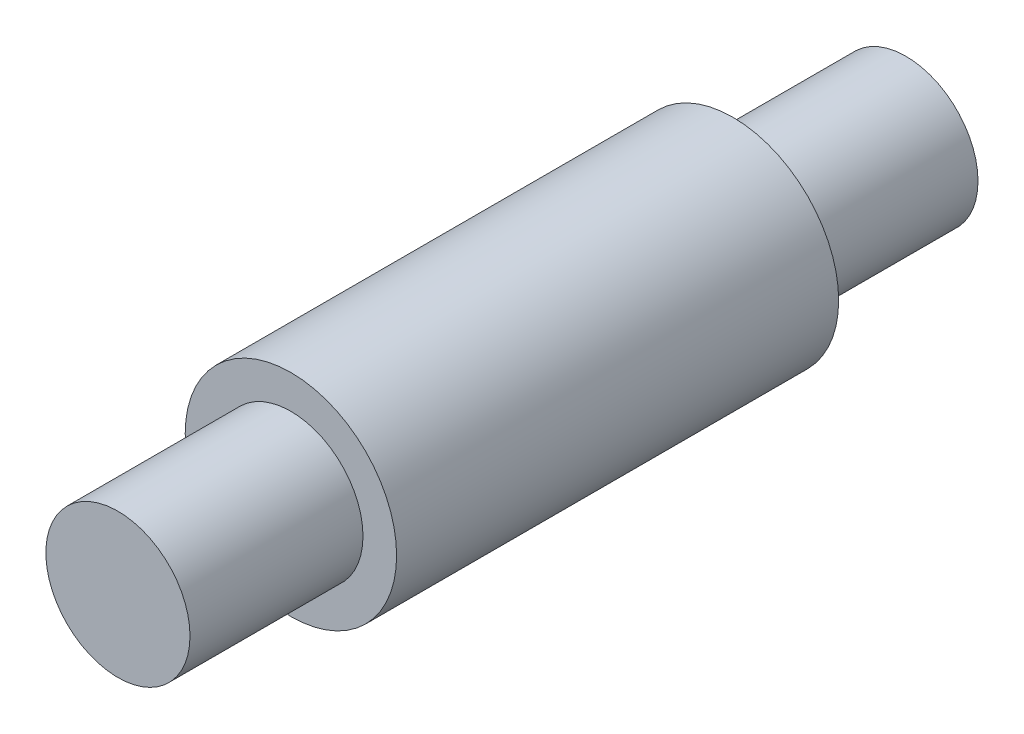
ISO-10303-21;
HEADER;
FILE_DESCRIPTION(('STEP AP214'),'2;1');
FILE_NAME('part.step','',(''),(''),'','','');
FILE_SCHEMA(('AUTOMOTIVE_DESIGN { 1 0 10303 214 1 1 1 1 }'));
ENDSEC;
DATA;
#1=APPLICATION_CONTEXT('core data for automotive mechanical design processes');
#2=APPLICATION_PROTOCOL_DEFINITION('international standard','automotive_design',2000,#1);
#3=PRODUCT_CONTEXT('',#1,'mechanical');
#4=PRODUCT('Part','Part','',(#3));
#5=PRODUCT_RELATED_PRODUCT_CATEGORY('part','',(#4));
#6=PRODUCT_DEFINITION_FORMATION('','',#4);
#7=PRODUCT_DEFINITION_CONTEXT('part definition',#1,'design');
#8=PRODUCT_DEFINITION('design','',#6,#7);
#9=PRODUCT_DEFINITION_SHAPE('','',#8);
#10=(LENGTH_UNIT() NAMED_UNIT(*) SI_UNIT(.MILLI.,.METRE.));
#11=(NAMED_UNIT(*) PLANE_ANGLE_UNIT() SI_UNIT($,.RADIAN.));
#12=(NAMED_UNIT(*) SI_UNIT($,.STERADIAN.) SOLID_ANGLE_UNIT());
#13=UNCERTAINTY_MEASURE_WITH_UNIT(LENGTH_MEASURE(1.E-05),#10,'distance_accuracy_value','');
#14=(GEOMETRIC_REPRESENTATION_CONTEXT(3) GLOBAL_UNCERTAINTY_ASSIGNED_CONTEXT((#13)) GLOBAL_UNIT_ASSIGNED_CONTEXT((#10,
#11,#12)) REPRESENTATION_CONTEXT('',''));
#15=CARTESIAN_POINT('',(0.,0.,0.));
#16=DIRECTION('',(0.,0.,1.));
#17=DIRECTION('',(1.,0.,0.));
#18=AXIS2_PLACEMENT_3D('',#15,#16,#17);
#19=CARTESIAN_POINT('',(0.,0.,23.));
#20=DIRECTION('',(0.,0.,-1.));
#21=DIRECTION('',(-1.,0.,0.));
#22=AXIS2_PLACEMENT_3D('',#19,#20,#21);
#23=CYLINDRICAL_SURFACE('',#22,11.);
#24=CARTESIAN_POINT('',(0.,0.,23.));
#25=DIRECTION('',(0.,0.,1.));
#26=DIRECTION('',(1.,0.,0.));
#27=AXIS2_PLACEMENT_3D('',#24,#25,#26);
#28=CIRCLE('',#27,11.);
#29=CARTESIAN_POINT('',(11.,0.,23.));
#30=VERTEX_POINT('',#29);
#31=EDGE_CURVE('E791',#30,#30,#28,.T.);
#32=ORIENTED_EDGE('',*,*,#31,.F.);
#33=EDGE_LOOP('',(#32));
#34=FACE_BOUND('',#33,.T.);
#35=CARTESIAN_POINT('',(0.,0.,-23.));
#36=DIRECTION('',(0.,0.,1.));
#37=DIRECTION('',(1.,0.,0.));
#38=AXIS2_PLACEMENT_3D('',#35,#36,#37);
#39=CIRCLE('',#38,11.);
#40=CARTESIAN_POINT('',(11.,0.,-23.));
#41=VERTEX_POINT('',#40);
#42=EDGE_CURVE('E789',#41,#41,#39,.T.);
#43=ORIENTED_EDGE('',*,*,#42,.T.);
#44=EDGE_LOOP('',(#43));
#45=FACE_BOUND('',#44,.T.);
#46=ADVANCED_FACE('F787',(#34,#45),#23,.T.);
#47=CARTESIAN_POINT('',(0.,0.,23.));
#48=DIRECTION('',(0.,0.,1.));
#49=DIRECTION('',(1.,0.,0.));
#50=AXIS2_PLACEMENT_3D('',#47,#48,#49);
#51=PLANE('',#50);
#52=CARTESIAN_POINT('',(0.,0.,23.));
#53=DIRECTION('',(0.,0.,1.));
#54=DIRECTION('',(1.,0.,0.));
#55=AXIS2_PLACEMENT_3D('',#52,#53,#54);
#56=CIRCLE('',#55,7.5);
#57=CARTESIAN_POINT('',(7.5,0.,23.));
#58=VERTEX_POINT('',#57);
#59=EDGE_CURVE('E11',#58,#58,#56,.T.);
#60=ORIENTED_EDGE('',*,*,#59,.F.);
#61=EDGE_LOOP('',(#60));
#62=FACE_BOUND('',#61,.T.);
#63=ORIENTED_EDGE('',*,*,#31,.T.);
#64=EDGE_LOOP('',(#63));
#65=FACE_BOUND('',#64,.T.);
#66=ADVANCED_FACE('F828',(#62,#65),#51,.T.);
#67=CARTESIAN_POINT('',(0.,0.,-23.));
#68=DIRECTION('',(0.,0.,1.));
#69=DIRECTION('',(1.,0.,0.));
#70=AXIS2_PLACEMENT_3D('',#67,#68,#69);
#71=PLANE('',#70);
#72=CARTESIAN_POINT('',(0.,0.,-23.));
#73=DIRECTION('',(0.,0.,1.));
#74=DIRECTION('',(1.,0.,0.));
#75=AXIS2_PLACEMENT_3D('',#72,#73,#74);
#76=CIRCLE('',#75,7.5);
#77=CARTESIAN_POINT('',(7.5,0.,-23.));
#78=VERTEX_POINT('',#77);
#79=EDGE_CURVE('E810',#78,#78,#76,.T.);
#80=ORIENTED_EDGE('',*,*,#79,.T.);
#81=EDGE_LOOP('',(#80));
#82=FACE_BOUND('',#81,.T.);
#83=ORIENTED_EDGE('',*,*,#42,.F.);
#84=EDGE_LOOP('',(#83));
#85=FACE_BOUND('',#84,.T.);
#86=ADVANCED_FACE('F832',(#82,#85),#71,.F.);
#87=CARTESIAN_POINT('',(0.,0.,41.));
#88=DIRECTION('',(0.,0.,-1.));
#89=DIRECTION('',(-1.,0.,0.));
#90=AXIS2_PLACEMENT_3D('',#87,#88,#89);
#91=CYLINDRICAL_SURFACE('',#90,7.5);
#92=CARTESIAN_POINT('',(0.,0.,41.));
#93=DIRECTION('',(0.,0.,1.));
#94=DIRECTION('',(1.,0.,0.));
#95=AXIS2_PLACEMENT_3D('',#92,#93,#94);
#96=CIRCLE('',#95,7.5);
#97=CARTESIAN_POINT('',(7.5,0.,41.));
#98=VERTEX_POINT('',#97);
#99=EDGE_CURVE('E802',#98,#98,#96,.T.);
#100=ORIENTED_EDGE('',*,*,#99,.F.);
#101=EDGE_LOOP('',(#100));
#102=FACE_BOUND('',#101,.T.);
#103=ORIENTED_EDGE('',*,*,#59,.T.);
#104=EDGE_LOOP('',(#103));
#105=FACE_BOUND('',#104,.T.);
#106=ADVANCED_FACE('F849',(#102,#105),#91,.T.);
#107=CARTESIAN_POINT('',(0.,0.,41.));
#108=DIRECTION('',(0.,0.,1.));
#109=DIRECTION('',(1.,0.,0.));
#110=AXIS2_PLACEMENT_3D('',#107,#108,#109);
#111=PLANE('',#110);
#112=ORIENTED_EDGE('',*,*,#99,.T.);
#113=EDGE_LOOP('',(#112));
#114=FACE_BOUND('',#113,.T.);
#115=ADVANCED_FACE('F830',(#114),#111,.T.);
#116=CARTESIAN_POINT('',(0.,0.,-41.));
#117=DIRECTION('',(0.,0.,1.));
#118=DIRECTION('',(1.,0.,0.));
#119=AXIS2_PLACEMENT_3D('',#116,#117,#118);
#120=CYLINDRICAL_SURFACE('',#119,7.5);
#121=CARTESIAN_POINT('',(0.,0.,-41.));
#122=DIRECTION('',(0.,0.,1.));
#123=DIRECTION('',(1.,0.,0.));
#124=AXIS2_PLACEMENT_3D('',#121,#122,#123);
#125=CIRCLE('',#124,7.5);
#126=CARTESIAN_POINT('',(7.5,0.,-41.));
#127=VERTEX_POINT('',#126);
#128=EDGE_CURVE('E808',#127,#127,#125,.T.);
#129=ORIENTED_EDGE('',*,*,#128,.T.);
#130=EDGE_LOOP('',(#129));
#131=FACE_BOUND('',#130,.T.);
#132=ORIENTED_EDGE('',*,*,#79,.F.);
#133=EDGE_LOOP('',(#132));
#134=FACE_BOUND('',#133,.T.);
#135=ADVANCED_FACE('F816',(#131,#134),#120,.T.);
#136=CARTESIAN_POINT('',(0.,0.,-41.));
#137=DIRECTION('',(0.,0.,-1.));
#138=DIRECTION('',(1.,0.,0.));
#139=AXIS2_PLACEMENT_3D('',#136,#137,#138);
#140=PLANE('',#139);
#141=ORIENTED_EDGE('',*,*,#128,.F.);
#142=EDGE_LOOP('',(#141));
#143=FACE_BOUND('',#142,.T.);
#144=ADVANCED_FACE('F817',(#143),#140,.T.);
#145=CLOSED_SHELL('',(#46,#66,#86,#106,#115,#135,#144));
#146=MANIFOLD_SOLID_BREP('B2',#145);
#147=ADVANCED_BREP_SHAPE_REPRESENTATION('',(#18,#146),#14);
#148=SHAPE_DEFINITION_REPRESENTATION(#9,#147);
ENDSEC;
END-ISO-10303-21;
